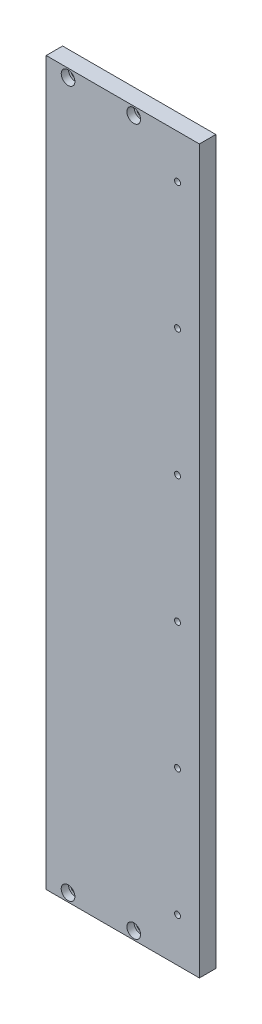
ISO-10303-21;
HEADER;
FILE_DESCRIPTION(('STEP AP214'),'2;1');
FILE_NAME('part.step','',(''),(''),'','','');
FILE_SCHEMA(('AUTOMOTIVE_DESIGN { 1 0 10303 214 1 1 1 1 }'));
ENDSEC;
DATA;
#1=APPLICATION_CONTEXT('core data for automotive mechanical design processes');
#2=APPLICATION_PROTOCOL_DEFINITION('international standard','automotive_design',2000,#1);
#3=PRODUCT_CONTEXT('',#1,'mechanical');
#4=PRODUCT('Part','Part','',(#3));
#5=PRODUCT_RELATED_PRODUCT_CATEGORY('part','',(#4));
#6=PRODUCT_DEFINITION_FORMATION('','',#4);
#7=PRODUCT_DEFINITION_CONTEXT('part definition',#1,'design');
#8=PRODUCT_DEFINITION('design','',#6,#7);
#9=PRODUCT_DEFINITION_SHAPE('','',#8);
#10=(LENGTH_UNIT() NAMED_UNIT(*) SI_UNIT(.MILLI.,.METRE.));
#11=(NAMED_UNIT(*) PLANE_ANGLE_UNIT() SI_UNIT($,.RADIAN.));
#12=(NAMED_UNIT(*) SI_UNIT($,.STERADIAN.) SOLID_ANGLE_UNIT());
#13=UNCERTAINTY_MEASURE_WITH_UNIT(LENGTH_MEASURE(1.E-05),#10,'distance_accuracy_value','');
#14=(GEOMETRIC_REPRESENTATION_CONTEXT(3) GLOBAL_UNCERTAINTY_ASSIGNED_CONTEXT((#13)) GLOBAL_UNIT_ASSIGNED_CONTEXT((#10,
#11,#12)) REPRESENTATION_CONTEXT('',''));
#15=CARTESIAN_POINT('',(0.,0.,0.));
#16=DIRECTION('',(0.,0.,1.));
#17=DIRECTION('',(1.,0.,0.));
#18=AXIS2_PLACEMENT_3D('',#15,#16,#17);
#19=CARTESIAN_POINT('',(-31.5092335801981,419.1,5.87188926459969));
#20=DIRECTION('',(1.,0.,0.));
#21=DIRECTION('',(0.,0.,-1.));
#22=AXIS2_PLACEMENT_3D('',#19,#20,#21);
#23=PLANE('',#22);
#24=CARTESIAN_POINT('',(-31.5092335801981,25.4,1.10938926459969));
#25=DIRECTION('',(-1.,0.,0.));
#26=DIRECTION('',(0.,0.,1.));
#27=AXIS2_PLACEMENT_3D('',#24,#25,#26);
#28=CIRCLE('',#27,1.7272);
#29=CARTESIAN_POINT('',(-31.5092335801981,25.4,2.83658926459969));
#30=VERTEX_POINT('',#29);
#31=EDGE_CURVE('E132',#30,#30,#28,.T.);
#32=ORIENTED_EDGE('',*,*,#31,.F.);
#33=EDGE_LOOP('',(#32));
#34=FACE_BOUND('',#33,.T.);
#35=CARTESIAN_POINT('',(-31.5092335801981,99.06,1.10938926459969));
#36=DIRECTION('',(-1.,0.,0.));
#37=DIRECTION('',(0.,0.,1.));
#38=AXIS2_PLACEMENT_3D('',#35,#36,#37);
#39=CIRCLE('',#38,1.7272);
#40=CARTESIAN_POINT('',(-31.5092335801981,99.06,2.83658926459969));
#41=VERTEX_POINT('',#40);
#42=EDGE_CURVE('E131',#41,#41,#39,.T.);
#43=ORIENTED_EDGE('',*,*,#42,.F.);
#44=EDGE_LOOP('',(#43));
#45=FACE_BOUND('',#44,.T.);
#46=CARTESIAN_POINT('',(-31.5092335801981,172.72,1.10938926459969));
#47=DIRECTION('',(-1.,0.,0.));
#48=DIRECTION('',(0.,0.,1.));
#49=AXIS2_PLACEMENT_3D('',#46,#47,#48);
#50=CIRCLE('',#49,1.72719999999998);
#51=CARTESIAN_POINT('',(-31.5092335801981,172.72,2.83658926459968));
#52=VERTEX_POINT('',#51);
#53=EDGE_CURVE('E142',#52,#52,#50,.T.);
#54=ORIENTED_EDGE('',*,*,#53,.F.);
#55=EDGE_LOOP('',(#54));
#56=FACE_BOUND('',#55,.T.);
#57=CARTESIAN_POINT('',(-31.5092335801981,246.38,1.10938926459969));
#58=DIRECTION('',(-1.,0.,0.));
#59=DIRECTION('',(0.,0.,1.));
#60=AXIS2_PLACEMENT_3D('',#57,#58,#59);
#61=CIRCLE('',#60,1.72719999999998);
#62=CARTESIAN_POINT('',(-31.5092335801981,246.38,2.83658926459968));
#63=VERTEX_POINT('',#62);
#64=EDGE_CURVE('E148',#63,#63,#61,.T.);
#65=ORIENTED_EDGE('',*,*,#64,.F.);
#66=EDGE_LOOP('',(#65));
#67=FACE_BOUND('',#66,.T.);
#68=CARTESIAN_POINT('',(-31.5092335801981,320.04,1.10938926459969));
#69=DIRECTION('',(-1.,0.,0.));
#70=DIRECTION('',(0.,0.,1.));
#71=AXIS2_PLACEMENT_3D('',#68,#69,#70);
#72=CIRCLE('',#71,1.72719999999998);
#73=CARTESIAN_POINT('',(-31.5092335801981,320.04,2.83658926459968));
#74=VERTEX_POINT('',#73);
#75=EDGE_CURVE('E154',#74,#74,#72,.T.);
#76=ORIENTED_EDGE('',*,*,#75,.F.);
#77=EDGE_LOOP('',(#76));
#78=FACE_BOUND('',#77,.T.);
#79=CARTESIAN_POINT('',(-31.5092335801981,393.7,1.10938926459969));
#80=DIRECTION('',(-1.,0.,0.));
#81=DIRECTION('',(0.,0.,1.));
#82=AXIS2_PLACEMENT_3D('',#79,#80,#81);
#83=CIRCLE('',#82,1.72719999999998);
#84=CARTESIAN_POINT('',(-31.5092335801981,393.7,2.83658926459968));
#85=VERTEX_POINT('',#84);
#86=EDGE_CURVE('E160',#85,#85,#83,.T.);
#87=ORIENTED_EDGE('',*,*,#86,.F.);
#88=EDGE_LOOP('',(#87));
#89=FACE_BOUND('',#88,.T.);
#90=DIRECTION('',(0.,0.,1.));
#91=VECTOR('',#90,1.);
#92=CARTESIAN_POINT('',(-31.5092335801981,0.,5.87188926459969));
#93=LINE('',#92,#91);
#94=CARTESIAN_POINT('',(-31.5092335801981,0.,-3.65311073540031));
#95=VERTEX_POINT('',#94);
#96=CARTESIAN_POINT('',(-31.5092335801981,0.,5.87188926459969));
#97=VERTEX_POINT('',#96);
#98=EDGE_CURVE('E250',#95,#97,#93,.T.);
#99=ORIENTED_EDGE('',*,*,#98,.T.);
#100=DIRECTION('',(0.,-1.,0.));
#101=VECTOR('',#100,1.);
#102=CARTESIAN_POINT('',(-31.5092335801981,419.1,5.87188926459969));
#103=LINE('',#102,#101);
#104=CARTESIAN_POINT('',(-31.5092335801981,419.1,5.87188926459969));
#105=VERTEX_POINT('',#104);
#106=EDGE_CURVE('E11',#105,#97,#103,.T.);
#107=ORIENTED_EDGE('',*,*,#106,.F.);
#108=DIRECTION('',(0.,0.,1.));
#109=VECTOR('',#108,1.);
#110=CARTESIAN_POINT('',(-31.5092335801981,419.1,5.87188926459969));
#111=LINE('',#110,#109);
#112=CARTESIAN_POINT('',(-31.5092335801981,419.1,-3.65311073540031));
#113=VERTEX_POINT('',#112);
#114=EDGE_CURVE('E251',#113,#105,#111,.T.);
#115=ORIENTED_EDGE('',*,*,#114,.F.);
#116=DIRECTION('',(0.,-1.,0.));
#117=VECTOR('',#116,1.);
#118=CARTESIAN_POINT('',(-31.5092335801981,419.1,-3.65311073540031));
#119=LINE('',#118,#117);
#120=EDGE_CURVE('E257',#113,#95,#119,.T.);
#121=ORIENTED_EDGE('',*,*,#120,.T.);
#122=EDGE_LOOP('',(#99,#107,#115,#121));
#123=FACE_BOUND('',#122,.T.);
#124=ADVANCED_FACE('F37',(#34,#45,#56,#67,#78,#89,#123),#23,.F.);
#125=CARTESIAN_POINT('',(-31.5092335801981,419.1,5.87188926459969));
#126=DIRECTION('',(0.,0.,-1.));
#127=DIRECTION('',(-1.,0.,0.));
#128=AXIS2_PLACEMENT_3D('',#125,#126,#127);
#129=PLANE('',#128);
#130=CARTESIAN_POINT('',(19.2907664198019,414.3375,5.87188926459969));
#131=DIRECTION('',(0.,0.,1.));
#132=DIRECTION('',(1.,0.,0.));
#133=AXIS2_PLACEMENT_3D('',#130,#131,#132);
#134=CIRCLE('',#133,3.96875);
#135=CARTESIAN_POINT('',(23.2595164198019,414.3375,5.87188926459969));
#136=VERTEX_POINT('',#135);
#137=EDGE_CURVE('E166',#136,#136,#134,.T.);
#138=ORIENTED_EDGE('',*,*,#137,.F.);
#139=EDGE_LOOP('',(#138));
#140=FACE_BOUND('',#139,.T.);
#141=CARTESIAN_POINT('',(-18.8092335801981,414.3375,5.87188926459969));
#142=DIRECTION('',(0.,0.,1.));
#143=DIRECTION('',(1.,0.,0.));
#144=AXIS2_PLACEMENT_3D('',#141,#142,#143);
#145=CIRCLE('',#144,3.96875);
#146=CARTESIAN_POINT('',(-14.8404835801981,414.3375,5.87188926459969));
#147=VERTEX_POINT('',#146);
#148=EDGE_CURVE('E178',#147,#147,#145,.T.);
#149=ORIENTED_EDGE('',*,*,#148,.F.);
#150=EDGE_LOOP('',(#149));
#151=FACE_BOUND('',#150,.T.);
#152=CARTESIAN_POINT('',(-18.8092335801981,4.7625,5.87188926459969));
#153=DIRECTION('',(0.,0.,1.));
#154=DIRECTION('',(1.,0.,0.));
#155=AXIS2_PLACEMENT_3D('',#152,#153,#154);
#156=CIRCLE('',#155,3.96875);
#157=CARTESIAN_POINT('',(-14.8404835801981,4.7625,5.87188926459969));
#158=VERTEX_POINT('',#157);
#159=EDGE_CURVE('E190',#158,#158,#156,.T.);
#160=ORIENTED_EDGE('',*,*,#159,.F.);
#161=EDGE_LOOP('',(#160));
#162=FACE_BOUND('',#161,.T.);
#163=CARTESIAN_POINT('',(19.2907664198019,4.7625,5.87188926459969));
#164=DIRECTION('',(0.,0.,1.));
#165=DIRECTION('',(1.,0.,0.));
#166=AXIS2_PLACEMENT_3D('',#163,#164,#165);
#167=CIRCLE('',#166,3.96875);
#168=CARTESIAN_POINT('',(23.2595164198019,4.7625,5.87188926459969));
#169=VERTEX_POINT('',#168);
#170=EDGE_CURVE('E202',#169,#169,#167,.T.);
#171=ORIENTED_EDGE('',*,*,#170,.F.);
#172=EDGE_LOOP('',(#171));
#173=FACE_BOUND('',#172,.T.);
#174=CARTESIAN_POINT('',(44.6907664198019,25.4,5.87188926459969));
#175=DIRECTION('',(0.,0.,1.));
#176=DIRECTION('',(1.,0.,0.));
#177=AXIS2_PLACEMENT_3D('',#174,#175,#176);
#178=CIRCLE('',#177,1.7272);
#179=CARTESIAN_POINT('',(46.4179664198019,25.4,5.87188926459969));
#180=VERTEX_POINT('',#179);
#181=EDGE_CURVE('E214',#180,#180,#178,.T.);
#182=ORIENTED_EDGE('',*,*,#181,.F.);
#183=EDGE_LOOP('',(#182));
#184=FACE_BOUND('',#183,.T.);
#185=CARTESIAN_POINT('',(44.6907664198019,99.06,5.87188926459969));
#186=DIRECTION('',(0.,0.,1.));
#187=DIRECTION('',(1.,0.,0.));
#188=AXIS2_PLACEMENT_3D('',#185,#186,#187);
#189=CIRCLE('',#188,1.7272);
#190=CARTESIAN_POINT('',(46.4179664198019,99.06,5.87188926459969));
#191=VERTEX_POINT('',#190);
#192=EDGE_CURVE('E220',#191,#191,#189,.T.);
#193=ORIENTED_EDGE('',*,*,#192,.F.);
#194=EDGE_LOOP('',(#193));
#195=FACE_BOUND('',#194,.T.);
#196=CARTESIAN_POINT('',(44.6907664198019,172.72,5.87188926459969));
#197=DIRECTION('',(0.,0.,1.));
#198=DIRECTION('',(1.,0.,0.));
#199=AXIS2_PLACEMENT_3D('',#196,#197,#198);
#200=CIRCLE('',#199,1.7272);
#201=CARTESIAN_POINT('',(46.4179664198019,172.72,5.87188926459969));
#202=VERTEX_POINT('',#201);
#203=EDGE_CURVE('E226',#202,#202,#200,.T.);
#204=ORIENTED_EDGE('',*,*,#203,.F.);
#205=EDGE_LOOP('',(#204));
#206=FACE_BOUND('',#205,.T.);
#207=CARTESIAN_POINT('',(44.6907664198019,246.38,5.87188926459969));
#208=DIRECTION('',(0.,0.,1.));
#209=DIRECTION('',(1.,0.,0.));
#210=AXIS2_PLACEMENT_3D('',#207,#208,#209);
#211=CIRCLE('',#210,1.7272);
#212=CARTESIAN_POINT('',(46.4179664198019,246.38,5.87188926459969));
#213=VERTEX_POINT('',#212);
#214=EDGE_CURVE('E232',#213,#213,#211,.T.);
#215=ORIENTED_EDGE('',*,*,#214,.F.);
#216=EDGE_LOOP('',(#215));
#217=FACE_BOUND('',#216,.T.);
#218=CARTESIAN_POINT('',(44.6907664198019,320.04,5.87188926459969));
#219=DIRECTION('',(0.,0.,1.));
#220=DIRECTION('',(1.,0.,0.));
#221=AXIS2_PLACEMENT_3D('',#218,#219,#220);
#222=CIRCLE('',#221,1.7272);
#223=CARTESIAN_POINT('',(46.4179664198019,320.04,5.87188926459969));
#224=VERTEX_POINT('',#223);
#225=EDGE_CURVE('E238',#224,#224,#222,.T.);
#226=ORIENTED_EDGE('',*,*,#225,.F.);
#227=EDGE_LOOP('',(#226));
#228=FACE_BOUND('',#227,.T.);
#229=CARTESIAN_POINT('',(44.6907664198019,393.7,5.87188926459969));
#230=DIRECTION('',(0.,0.,1.));
#231=DIRECTION('',(1.,0.,0.));
#232=AXIS2_PLACEMENT_3D('',#229,#230,#231);
#233=CIRCLE('',#232,1.7272);
#234=CARTESIAN_POINT('',(46.4179664198019,393.7,5.87188926459969));
#235=VERTEX_POINT('',#234);
#236=EDGE_CURVE('E244',#235,#235,#233,.T.);
#237=ORIENTED_EDGE('',*,*,#236,.F.);
#238=EDGE_LOOP('',(#237));
#239=FACE_BOUND('',#238,.T.);
#240=DIRECTION('',(1.,0.,0.));
#241=VECTOR('',#240,1.);
#242=CARTESIAN_POINT('',(-31.5092335801981,0.,5.87188926459969));
#243=LINE('',#242,#241);
#244=CARTESIAN_POINT('',(57.3907664198019,0.,5.87188926459969));
#245=VERTEX_POINT('',#244);
#246=EDGE_CURVE('E260',#97,#245,#243,.T.);
#247=ORIENTED_EDGE('',*,*,#246,.T.);
#248=DIRECTION('',(0.,-1.,0.));
#249=VECTOR('',#248,1.);
#250=CARTESIAN_POINT('',(57.3907664198019,419.1,5.87188926459969));
#251=LINE('',#250,#249);
#252=CARTESIAN_POINT('',(57.3907664198019,419.1,5.87188926459969));
#253=VERTEX_POINT('',#252);
#254=EDGE_CURVE('E45',#253,#245,#251,.T.);
#255=ORIENTED_EDGE('',*,*,#254,.F.);
#256=DIRECTION('',(1.,0.,0.));
#257=VECTOR('',#256,1.);
#258=CARTESIAN_POINT('',(-31.5092335801981,419.1,5.87188926459969));
#259=LINE('',#258,#257);
#260=EDGE_CURVE('E84',#105,#253,#259,.T.);
#261=ORIENTED_EDGE('',*,*,#260,.F.);
#262=ORIENTED_EDGE('',*,*,#106,.T.);
#263=EDGE_LOOP('',(#247,#255,#261,#262));
#264=FACE_BOUND('',#263,.T.);
#265=ADVANCED_FACE('F284',(#140,#151,#162,#173,#184,#195,#206,#217,#228,#239,#264),#129,.F.);
#266=CARTESIAN_POINT('',(57.3907664198019,419.1,5.87188926459969));
#267=DIRECTION('',(-1.,0.,0.));
#268=DIRECTION('',(0.,0.,1.));
#269=AXIS2_PLACEMENT_3D('',#266,#267,#268);
#270=PLANE('',#269);
#271=DIRECTION('',(0.,0.,-1.));
#272=VECTOR('',#271,1.);
#273=CARTESIAN_POINT('',(57.3907664198019,0.,5.87188926459969));
#274=LINE('',#273,#272);
#275=CARTESIAN_POINT('',(57.3907664198019,0.,-3.65311073540031));
#276=VERTEX_POINT('',#275);
#277=EDGE_CURVE('E71',#245,#276,#274,.T.);
#278=ORIENTED_EDGE('',*,*,#277,.T.);
#279=DIRECTION('',(0.,-1.,0.));
#280=VECTOR('',#279,1.);
#281=CARTESIAN_POINT('',(57.3907664198019,419.1,-3.65311073540031));
#282=LINE('',#281,#280);
#283=CARTESIAN_POINT('',(57.3907664198019,419.1,-3.65311073540031));
#284=VERTEX_POINT('',#283);
#285=EDGE_CURVE('E265',#284,#276,#282,.T.);
#286=ORIENTED_EDGE('',*,*,#285,.F.);
#287=DIRECTION('',(0.,0.,-1.));
#288=VECTOR('',#287,1.);
#289=CARTESIAN_POINT('',(57.3907664198019,419.1,5.87188926459969));
#290=LINE('',#289,#288);
#291=EDGE_CURVE('E254',#253,#284,#290,.T.);
#292=ORIENTED_EDGE('',*,*,#291,.F.);
#293=ORIENTED_EDGE('',*,*,#254,.T.);
#294=EDGE_LOOP('',(#278,#286,#292,#293));
#295=FACE_BOUND('',#294,.T.);
#296=ADVANCED_FACE('F267',(#295),#270,.F.);
#297=CARTESIAN_POINT('',(-31.5092335801981,419.1,-3.65311073540031));
#298=DIRECTION('',(0.,0.,1.));
#299=DIRECTION('',(1.,0.,0.));
#300=AXIS2_PLACEMENT_3D('',#297,#298,#299);
#301=PLANE('',#300);
#302=CARTESIAN_POINT('',(19.2907664198019,414.3375,-3.65311073540031));
#303=DIRECTION('',(0.,0.,1.));
#304=DIRECTION('',(1.,0.,0.));
#305=AXIS2_PLACEMENT_3D('',#302,#303,#304);
#306=CIRCLE('',#305,2.45745);
#307=CARTESIAN_POINT('',(21.7482164198019,414.3375,-3.65311073540031));
#308=VERTEX_POINT('',#307);
#309=EDGE_CURVE('E175',#308,#308,#306,.T.);
#310=ORIENTED_EDGE('',*,*,#309,.T.);
#311=EDGE_LOOP('',(#310));
#312=FACE_BOUND('',#311,.T.);
#313=CARTESIAN_POINT('',(-18.8092335801981,414.3375,-3.65311073540031));
#314=DIRECTION('',(0.,0.,1.));
#315=DIRECTION('',(1.,0.,0.));
#316=AXIS2_PLACEMENT_3D('',#313,#314,#315);
#317=CIRCLE('',#316,2.45745);
#318=CARTESIAN_POINT('',(-16.3517835801981,414.3375,-3.65311073540031));
#319=VERTEX_POINT('',#318);
#320=EDGE_CURVE('E187',#319,#319,#317,.T.);
#321=ORIENTED_EDGE('',*,*,#320,.T.);
#322=EDGE_LOOP('',(#321));
#323=FACE_BOUND('',#322,.T.);
#324=CARTESIAN_POINT('',(-18.8092335801981,4.7625,-3.65311073540031));
#325=DIRECTION('',(0.,0.,1.));
#326=DIRECTION('',(1.,0.,0.));
#327=AXIS2_PLACEMENT_3D('',#324,#325,#326);
#328=CIRCLE('',#327,2.45745);
#329=CARTESIAN_POINT('',(-16.3517835801981,4.7625,-3.65311073540031));
#330=VERTEX_POINT('',#329);
#331=EDGE_CURVE('E199',#330,#330,#328,.T.);
#332=ORIENTED_EDGE('',*,*,#331,.T.);
#333=EDGE_LOOP('',(#332));
#334=FACE_BOUND('',#333,.T.);
#335=CARTESIAN_POINT('',(19.2907664198019,4.7625,-3.65311073540031));
#336=DIRECTION('',(0.,0.,1.));
#337=DIRECTION('',(1.,0.,0.));
#338=AXIS2_PLACEMENT_3D('',#335,#336,#337);
#339=CIRCLE('',#338,2.45745);
#340=CARTESIAN_POINT('',(21.7482164198019,4.7625,-3.65311073540031));
#341=VERTEX_POINT('',#340);
#342=EDGE_CURVE('E211',#341,#341,#339,.T.);
#343=ORIENTED_EDGE('',*,*,#342,.T.);
#344=EDGE_LOOP('',(#343));
#345=FACE_BOUND('',#344,.T.);
#346=DIRECTION('',(-1.,0.,0.));
#347=VECTOR('',#346,1.);
#348=CARTESIAN_POINT('',(-31.5092335801981,0.,-3.65311073540031));
#349=LINE('',#348,#347);
#350=EDGE_CURVE('E77',#276,#95,#349,.T.);
#351=ORIENTED_EDGE('',*,*,#350,.T.);
#352=ORIENTED_EDGE('',*,*,#120,.F.);
#353=DIRECTION('',(-1.,0.,0.));
#354=VECTOR('',#353,1.);
#355=CARTESIAN_POINT('',(-31.5092335801981,419.1,-3.65311073540031));
#356=LINE('',#355,#354);
#357=EDGE_CURVE('E53',#284,#113,#356,.T.);
#358=ORIENTED_EDGE('',*,*,#357,.F.);
#359=ORIENTED_EDGE('',*,*,#285,.T.);
#360=EDGE_LOOP('',(#351,#352,#358,#359));
#361=FACE_BOUND('',#360,.T.);
#362=ADVANCED_FACE('F274',(#312,#323,#334,#345,#361),#301,.F.);
#363=CARTESIAN_POINT('',(0.,419.1,0.));
#364=DIRECTION('',(0.,-1.,0.));
#365=DIRECTION('',(0.,0.,-1.));
#366=AXIS2_PLACEMENT_3D('',#363,#364,#365);
#367=PLANE('',#366);
#368=ORIENTED_EDGE('',*,*,#114,.T.);
#369=ORIENTED_EDGE('',*,*,#260,.T.);
#370=ORIENTED_EDGE('',*,*,#291,.T.);
#371=ORIENTED_EDGE('',*,*,#357,.T.);
#372=EDGE_LOOP('',(#368,#369,#370,#371));
#373=FACE_BOUND('',#372,.T.);
#374=ADVANCED_FACE('F276',(#373),#367,.F.);
#375=CARTESIAN_POINT('',(0.,0.,0.));
#376=DIRECTION('',(0.,-1.,0.));
#377=DIRECTION('',(0.,0.,-1.));
#378=AXIS2_PLACEMENT_3D('',#375,#376,#377);
#379=PLANE('',#378);
#380=ORIENTED_EDGE('',*,*,#98,.F.);
#381=ORIENTED_EDGE('',*,*,#350,.F.);
#382=ORIENTED_EDGE('',*,*,#277,.F.);
#383=ORIENTED_EDGE('',*,*,#246,.F.);
#384=EDGE_LOOP('',(#380,#381,#382,#383));
#385=FACE_BOUND('',#384,.T.);
#386=ADVANCED_FACE('F270',(#385),#379,.T.);
#387=CARTESIAN_POINT('',(44.6907664198019,393.7,-1.7481107354003));
#388=DIRECTION('',(0.,0.,1.));
#389=DIRECTION('',(1.,0.,0.));
#390=AXIS2_PLACEMENT_3D('',#387,#388,#389);
#391=CONICAL_SURFACE('',#390,1.7272,1.02974425867665);
#392=CARTESIAN_POINT('',(44.6907664198019,393.7,-2.78591719658471));
#393=VERTEX_POINT('',#392);
#394=VERTEX_LOOP('',#393);
#395=FACE_BOUND('',#394,.T.);
#396=CARTESIAN_POINT('',(44.6907664198019,393.7,-1.7481107354003));
#397=DIRECTION('',(0.,0.,1.));
#398=DIRECTION('',(1.,0.,0.));
#399=AXIS2_PLACEMENT_3D('',#396,#397,#398);
#400=CIRCLE('',#399,1.7272);
#401=CARTESIAN_POINT('',(46.4179664198019,393.7,-1.7481107354003));
#402=VERTEX_POINT('',#401);
#403=EDGE_CURVE('E247',#402,#402,#400,.T.);
#404=ORIENTED_EDGE('',*,*,#403,.T.);
#405=EDGE_LOOP('',(#404));
#406=FACE_BOUND('',#405,.T.);
#407=ADVANCED_FACE('F415',(#395,#406),#391,.F.);
#408=CARTESIAN_POINT('',(44.6907664198019,393.7,5.87188926459969));
#409=DIRECTION('',(0.,0.,1.));
#410=DIRECTION('',(1.,0.,0.));
#411=AXIS2_PLACEMENT_3D('',#408,#409,#410);
#412=CYLINDRICAL_SURFACE('',#411,1.7272);
#413=ORIENTED_EDGE('',*,*,#403,.F.);
#414=EDGE_LOOP('',(#413));
#415=FACE_BOUND('',#414,.T.);
#416=ORIENTED_EDGE('',*,*,#236,.T.);
#417=EDGE_LOOP('',(#416));
#418=FACE_BOUND('',#417,.T.);
#419=ADVANCED_FACE('F411',(#415,#418),#412,.F.);
#420=CARTESIAN_POINT('',(44.6907664198019,320.04,-1.7481107354003));
#421=DIRECTION('',(0.,0.,1.));
#422=DIRECTION('',(1.,0.,0.));
#423=AXIS2_PLACEMENT_3D('',#420,#421,#422);
#424=CONICAL_SURFACE('',#423,1.7272,1.02974425867665);
#425=CARTESIAN_POINT('',(44.6907664198019,320.04,-2.78591719658471));
#426=VERTEX_POINT('',#425);
#427=VERTEX_LOOP('',#426);
#428=FACE_BOUND('',#427,.T.);
#429=CARTESIAN_POINT('',(44.6907664198019,320.04,-1.7481107354003));
#430=DIRECTION('',(0.,0.,1.));
#431=DIRECTION('',(1.,0.,0.));
#432=AXIS2_PLACEMENT_3D('',#429,#430,#431);
#433=CIRCLE('',#432,1.7272);
#434=CARTESIAN_POINT('',(46.4179664198019,320.04,-1.7481107354003));
#435=VERTEX_POINT('',#434);
#436=EDGE_CURVE('E241',#435,#435,#433,.T.);
#437=ORIENTED_EDGE('',*,*,#436,.T.);
#438=EDGE_LOOP('',(#437));
#439=FACE_BOUND('',#438,.T.);
#440=ADVANCED_FACE('F407',(#428,#439),#424,.F.);
#441=CARTESIAN_POINT('',(44.6907664198019,320.04,5.87188926459969));
#442=DIRECTION('',(0.,0.,1.));
#443=DIRECTION('',(1.,0.,0.));
#444=AXIS2_PLACEMENT_3D('',#441,#442,#443);
#445=CYLINDRICAL_SURFACE('',#444,1.7272);
#446=ORIENTED_EDGE('',*,*,#436,.F.);
#447=EDGE_LOOP('',(#446));
#448=FACE_BOUND('',#447,.T.);
#449=ORIENTED_EDGE('',*,*,#225,.T.);
#450=EDGE_LOOP('',(#449));
#451=FACE_BOUND('',#450,.T.);
#452=ADVANCED_FACE('F403',(#448,#451),#445,.F.);
#453=CARTESIAN_POINT('',(44.6907664198019,246.38,-1.7481107354003));
#454=DIRECTION('',(0.,0.,1.));
#455=DIRECTION('',(1.,0.,0.));
#456=AXIS2_PLACEMENT_3D('',#453,#454,#455);
#457=CONICAL_SURFACE('',#456,1.7272,1.02974425867665);
#458=CARTESIAN_POINT('',(44.6907664198019,246.38,-2.78591719658471));
#459=VERTEX_POINT('',#458);
#460=VERTEX_LOOP('',#459);
#461=FACE_BOUND('',#460,.T.);
#462=CARTESIAN_POINT('',(44.6907664198019,246.38,-1.7481107354003));
#463=DIRECTION('',(0.,0.,1.));
#464=DIRECTION('',(1.,0.,0.));
#465=AXIS2_PLACEMENT_3D('',#462,#463,#464);
#466=CIRCLE('',#465,1.7272);
#467=CARTESIAN_POINT('',(46.4179664198019,246.38,-1.7481107354003));
#468=VERTEX_POINT('',#467);
#469=EDGE_CURVE('E235',#468,#468,#466,.T.);
#470=ORIENTED_EDGE('',*,*,#469,.T.);
#471=EDGE_LOOP('',(#470));
#472=FACE_BOUND('',#471,.T.);
#473=ADVANCED_FACE('F399',(#461,#472),#457,.F.);
#474=CARTESIAN_POINT('',(44.6907664198019,246.38,5.87188926459969));
#475=DIRECTION('',(0.,0.,1.));
#476=DIRECTION('',(1.,0.,0.));
#477=AXIS2_PLACEMENT_3D('',#474,#475,#476);
#478=CYLINDRICAL_SURFACE('',#477,1.7272);
#479=ORIENTED_EDGE('',*,*,#469,.F.);
#480=EDGE_LOOP('',(#479));
#481=FACE_BOUND('',#480,.T.);
#482=ORIENTED_EDGE('',*,*,#214,.T.);
#483=EDGE_LOOP('',(#482));
#484=FACE_BOUND('',#483,.T.);
#485=ADVANCED_FACE('F395',(#481,#484),#478,.F.);
#486=CARTESIAN_POINT('',(44.6907664198019,172.72,-1.7481107354003));
#487=DIRECTION('',(0.,0.,1.));
#488=DIRECTION('',(1.,0.,0.));
#489=AXIS2_PLACEMENT_3D('',#486,#487,#488);
#490=CONICAL_SURFACE('',#489,1.7272,1.02974425867665);
#491=CARTESIAN_POINT('',(44.6907664198019,172.72,-2.78591719658471));
#492=VERTEX_POINT('',#491);
#493=VERTEX_LOOP('',#492);
#494=FACE_BOUND('',#493,.T.);
#495=CARTESIAN_POINT('',(44.6907664198019,172.72,-1.7481107354003));
#496=DIRECTION('',(0.,0.,1.));
#497=DIRECTION('',(1.,0.,0.));
#498=AXIS2_PLACEMENT_3D('',#495,#496,#497);
#499=CIRCLE('',#498,1.7272);
#500=CARTESIAN_POINT('',(46.4179664198019,172.72,-1.7481107354003));
#501=VERTEX_POINT('',#500);
#502=EDGE_CURVE('E229',#501,#501,#499,.T.);
#503=ORIENTED_EDGE('',*,*,#502,.T.);
#504=EDGE_LOOP('',(#503));
#505=FACE_BOUND('',#504,.T.);
#506=ADVANCED_FACE('F391',(#494,#505),#490,.F.);
#507=CARTESIAN_POINT('',(44.6907664198019,172.72,5.87188926459969));
#508=DIRECTION('',(0.,0.,1.));
#509=DIRECTION('',(1.,0.,0.));
#510=AXIS2_PLACEMENT_3D('',#507,#508,#509);
#511=CYLINDRICAL_SURFACE('',#510,1.7272);
#512=ORIENTED_EDGE('',*,*,#502,.F.);
#513=EDGE_LOOP('',(#512));
#514=FACE_BOUND('',#513,.T.);
#515=ORIENTED_EDGE('',*,*,#203,.T.);
#516=EDGE_LOOP('',(#515));
#517=FACE_BOUND('',#516,.T.);
#518=ADVANCED_FACE('F387',(#514,#517),#511,.F.);
#519=CARTESIAN_POINT('',(44.6907664198019,99.06,-1.7481107354003));
#520=DIRECTION('',(0.,0.,1.));
#521=DIRECTION('',(1.,0.,0.));
#522=AXIS2_PLACEMENT_3D('',#519,#520,#521);
#523=CONICAL_SURFACE('',#522,1.7272,1.02974425867665);
#524=CARTESIAN_POINT('',(44.6907664198019,99.06,-2.78591719658471));
#525=VERTEX_POINT('',#524);
#526=VERTEX_LOOP('',#525);
#527=FACE_BOUND('',#526,.T.);
#528=CARTESIAN_POINT('',(44.6907664198019,99.06,-1.7481107354003));
#529=DIRECTION('',(0.,0.,1.));
#530=DIRECTION('',(1.,0.,0.));
#531=AXIS2_PLACEMENT_3D('',#528,#529,#530);
#532=CIRCLE('',#531,1.7272);
#533=CARTESIAN_POINT('',(46.4179664198019,99.06,-1.7481107354003));
#534=VERTEX_POINT('',#533);
#535=EDGE_CURVE('E223',#534,#534,#532,.T.);
#536=ORIENTED_EDGE('',*,*,#535,.T.);
#537=EDGE_LOOP('',(#536));
#538=FACE_BOUND('',#537,.T.);
#539=ADVANCED_FACE('F383',(#527,#538),#523,.F.);
#540=CARTESIAN_POINT('',(44.6907664198019,99.06,5.87188926459969));
#541=DIRECTION('',(0.,0.,1.));
#542=DIRECTION('',(1.,0.,0.));
#543=AXIS2_PLACEMENT_3D('',#540,#541,#542);
#544=CYLINDRICAL_SURFACE('',#543,1.7272);
#545=ORIENTED_EDGE('',*,*,#535,.F.);
#546=EDGE_LOOP('',(#545));
#547=FACE_BOUND('',#546,.T.);
#548=ORIENTED_EDGE('',*,*,#192,.T.);
#549=EDGE_LOOP('',(#548));
#550=FACE_BOUND('',#549,.T.);
#551=ADVANCED_FACE('F379',(#547,#550),#544,.F.);
#552=CARTESIAN_POINT('',(44.6907664198019,25.4,-1.7481107354003));
#553=DIRECTION('',(0.,0.,1.));
#554=DIRECTION('',(1.,0.,0.));
#555=AXIS2_PLACEMENT_3D('',#552,#553,#554);
#556=CONICAL_SURFACE('',#555,1.7272,1.02974425867665);
#557=CARTESIAN_POINT('',(44.6907664198019,25.4,-2.78591719658471));
#558=VERTEX_POINT('',#557);
#559=VERTEX_LOOP('',#558);
#560=FACE_BOUND('',#559,.T.);
#561=CARTESIAN_POINT('',(44.6907664198019,25.4,-1.7481107354003));
#562=DIRECTION('',(0.,0.,1.));
#563=DIRECTION('',(1.,0.,0.));
#564=AXIS2_PLACEMENT_3D('',#561,#562,#563);
#565=CIRCLE('',#564,1.7272);
#566=CARTESIAN_POINT('',(46.4179664198019,25.4,-1.7481107354003));
#567=VERTEX_POINT('',#566);
#568=EDGE_CURVE('E217',#567,#567,#565,.T.);
#569=ORIENTED_EDGE('',*,*,#568,.T.);
#570=EDGE_LOOP('',(#569));
#571=FACE_BOUND('',#570,.T.);
#572=ADVANCED_FACE('F375',(#560,#571),#556,.F.);
#573=CARTESIAN_POINT('',(44.6907664198019,25.4,5.87188926459969));
#574=DIRECTION('',(0.,0.,1.));
#575=DIRECTION('',(1.,0.,0.));
#576=AXIS2_PLACEMENT_3D('',#573,#574,#575);
#577=CYLINDRICAL_SURFACE('',#576,1.7272);
#578=ORIENTED_EDGE('',*,*,#568,.F.);
#579=EDGE_LOOP('',(#578));
#580=FACE_BOUND('',#579,.T.);
#581=ORIENTED_EDGE('',*,*,#181,.T.);
#582=EDGE_LOOP('',(#581));
#583=FACE_BOUND('',#582,.T.);
#584=ADVANCED_FACE('F371',(#580,#583),#577,.F.);
#585=CARTESIAN_POINT('',(19.2907664198019,4.7625,5.87188926459969));
#586=DIRECTION('',(0.,0.,1.));
#587=DIRECTION('',(1.,0.,0.));
#588=AXIS2_PLACEMENT_3D('',#585,#586,#587);
#589=CYLINDRICAL_SURFACE('',#588,2.45745);
#590=ORIENTED_EDGE('',*,*,#342,.F.);
#591=EDGE_LOOP('',(#590));
#592=FACE_BOUND('',#591,.T.);
#593=CARTESIAN_POINT('',(19.2907664198019,4.7625,1.70628926459969));
#594=DIRECTION('',(0.,0.,1.));
#595=DIRECTION('',(1.,0.,0.));
#596=AXIS2_PLACEMENT_3D('',#593,#594,#595);
#597=CIRCLE('',#596,2.45745);
#598=CARTESIAN_POINT('',(21.7482164198019,4.7625,1.70628926459969));
#599=VERTEX_POINT('',#598);
#600=EDGE_CURVE('E208',#599,#599,#597,.T.);
#601=ORIENTED_EDGE('',*,*,#600,.T.);
#602=EDGE_LOOP('',(#601));
#603=FACE_BOUND('',#602,.T.);
#604=ADVANCED_FACE('F367',(#592,#603),#589,.F.);
#605=CARTESIAN_POINT('',(21.7482164198019,4.7625,1.70628926459969));
#606=DIRECTION('',(0.,0.,-1.));
#607=DIRECTION('',(-1.,0.,0.));
#608=AXIS2_PLACEMENT_3D('',#605,#606,#607);
#609=PLANE('',#608);
#610=ORIENTED_EDGE('',*,*,#600,.F.);
#611=EDGE_LOOP('',(#610));
#612=FACE_BOUND('',#611,.T.);
#613=CARTESIAN_POINT('',(19.2907664198019,4.7625,1.70628926459969));
#614=DIRECTION('',(0.,0.,1.));
#615=DIRECTION('',(1.,0.,0.));
#616=AXIS2_PLACEMENT_3D('',#613,#614,#615);
#617=CIRCLE('',#616,3.96875);
#618=CARTESIAN_POINT('',(23.2595164198019,4.7625,1.70628926459969));
#619=VERTEX_POINT('',#618);
#620=EDGE_CURVE('E205',#619,#619,#617,.T.);
#621=ORIENTED_EDGE('',*,*,#620,.T.);
#622=EDGE_LOOP('',(#621));
#623=FACE_BOUND('',#622,.T.);
#624=ADVANCED_FACE('F363',(#612,#623),#609,.F.);
#625=CARTESIAN_POINT('',(19.2907664198019,4.7625,5.87188926459969));
#626=DIRECTION('',(0.,0.,1.));
#627=DIRECTION('',(1.,0.,0.));
#628=AXIS2_PLACEMENT_3D('',#625,#626,#627);
#629=CYLINDRICAL_SURFACE('',#628,3.96875);
#630=ORIENTED_EDGE('',*,*,#620,.F.);
#631=EDGE_LOOP('',(#630));
#632=FACE_BOUND('',#631,.T.);
#633=ORIENTED_EDGE('',*,*,#170,.T.);
#634=EDGE_LOOP('',(#633));
#635=FACE_BOUND('',#634,.T.);
#636=ADVANCED_FACE('F359',(#632,#635),#629,.F.);
#637=CARTESIAN_POINT('',(-18.8092335801981,4.7625,5.87188926459969));
#638=DIRECTION('',(0.,0.,1.));
#639=DIRECTION('',(1.,0.,0.));
#640=AXIS2_PLACEMENT_3D('',#637,#638,#639);
#641=CYLINDRICAL_SURFACE('',#640,2.45745);
#642=ORIENTED_EDGE('',*,*,#331,.F.);
#643=EDGE_LOOP('',(#642));
#644=FACE_BOUND('',#643,.T.);
#645=CARTESIAN_POINT('',(-18.8092335801981,4.7625,1.70628926459969));
#646=DIRECTION('',(0.,0.,1.));
#647=DIRECTION('',(1.,0.,0.));
#648=AXIS2_PLACEMENT_3D('',#645,#646,#647);
#649=CIRCLE('',#648,2.45745);
#650=CARTESIAN_POINT('',(-16.3517835801981,4.7625,1.70628926459969));
#651=VERTEX_POINT('',#650);
#652=EDGE_CURVE('E196',#651,#651,#649,.T.);
#653=ORIENTED_EDGE('',*,*,#652,.T.);
#654=EDGE_LOOP('',(#653));
#655=FACE_BOUND('',#654,.T.);
#656=ADVANCED_FACE('F355',(#644,#655),#641,.F.);
#657=CARTESIAN_POINT('',(-16.3517835801981,4.7625,1.70628926459969));
#658=DIRECTION('',(0.,0.,-1.));
#659=DIRECTION('',(-1.,0.,0.));
#660=AXIS2_PLACEMENT_3D('',#657,#658,#659);
#661=PLANE('',#660);
#662=ORIENTED_EDGE('',*,*,#652,.F.);
#663=EDGE_LOOP('',(#662));
#664=FACE_BOUND('',#663,.T.);
#665=CARTESIAN_POINT('',(-18.8092335801981,4.7625,1.70628926459969));
#666=DIRECTION('',(0.,0.,1.));
#667=DIRECTION('',(1.,0.,0.));
#668=AXIS2_PLACEMENT_3D('',#665,#666,#667);
#669=CIRCLE('',#668,3.96875);
#670=CARTESIAN_POINT('',(-14.8404835801981,4.7625,1.70628926459969));
#671=VERTEX_POINT('',#670);
#672=EDGE_CURVE('E193',#671,#671,#669,.T.);
#673=ORIENTED_EDGE('',*,*,#672,.T.);
#674=EDGE_LOOP('',(#673));
#675=FACE_BOUND('',#674,.T.);
#676=ADVANCED_FACE('F351',(#664,#675),#661,.F.);
#677=CARTESIAN_POINT('',(-18.8092335801981,4.7625,5.87188926459969));
#678=DIRECTION('',(0.,0.,1.));
#679=DIRECTION('',(1.,0.,0.));
#680=AXIS2_PLACEMENT_3D('',#677,#678,#679);
#681=CYLINDRICAL_SURFACE('',#680,3.96875);
#682=ORIENTED_EDGE('',*,*,#672,.F.);
#683=EDGE_LOOP('',(#682));
#684=FACE_BOUND('',#683,.T.);
#685=ORIENTED_EDGE('',*,*,#159,.T.);
#686=EDGE_LOOP('',(#685));
#687=FACE_BOUND('',#686,.T.);
#688=ADVANCED_FACE('F347',(#684,#687),#681,.F.);
#689=CARTESIAN_POINT('',(-18.8092335801981,414.3375,5.87188926459969));
#690=DIRECTION('',(0.,0.,1.));
#691=DIRECTION('',(1.,0.,0.));
#692=AXIS2_PLACEMENT_3D('',#689,#690,#691);
#693=CYLINDRICAL_SURFACE('',#692,2.45745);
#694=ORIENTED_EDGE('',*,*,#320,.F.);
#695=EDGE_LOOP('',(#694));
#696=FACE_BOUND('',#695,.T.);
#697=CARTESIAN_POINT('',(-18.8092335801981,414.3375,1.70628926459969));
#698=DIRECTION('',(0.,0.,1.));
#699=DIRECTION('',(1.,0.,0.));
#700=AXIS2_PLACEMENT_3D('',#697,#698,#699);
#701=CIRCLE('',#700,2.45745);
#702=CARTESIAN_POINT('',(-16.3517835801981,414.3375,1.70628926459969));
#703=VERTEX_POINT('',#702);
#704=EDGE_CURVE('E184',#703,#703,#701,.T.);
#705=ORIENTED_EDGE('',*,*,#704,.T.);
#706=EDGE_LOOP('',(#705));
#707=FACE_BOUND('',#706,.T.);
#708=ADVANCED_FACE('F343',(#696,#707),#693,.F.);
#709=CARTESIAN_POINT('',(-16.3517835801981,414.3375,1.70628926459969));
#710=DIRECTION('',(0.,0.,-1.));
#711=DIRECTION('',(-1.,0.,0.));
#712=AXIS2_PLACEMENT_3D('',#709,#710,#711);
#713=PLANE('',#712);
#714=ORIENTED_EDGE('',*,*,#704,.F.);
#715=EDGE_LOOP('',(#714));
#716=FACE_BOUND('',#715,.T.);
#717=CARTESIAN_POINT('',(-18.8092335801981,414.3375,1.70628926459969));
#718=DIRECTION('',(0.,0.,1.));
#719=DIRECTION('',(1.,0.,0.));
#720=AXIS2_PLACEMENT_3D('',#717,#718,#719);
#721=CIRCLE('',#720,3.96875);
#722=CARTESIAN_POINT('',(-14.8404835801981,414.3375,1.70628926459969));
#723=VERTEX_POINT('',#722);
#724=EDGE_CURVE('E181',#723,#723,#721,.T.);
#725=ORIENTED_EDGE('',*,*,#724,.T.);
#726=EDGE_LOOP('',(#725));
#727=FACE_BOUND('',#726,.T.);
#728=ADVANCED_FACE('F339',(#716,#727),#713,.F.);
#729=CARTESIAN_POINT('',(-18.8092335801981,414.3375,5.87188926459969));
#730=DIRECTION('',(0.,0.,1.));
#731=DIRECTION('',(1.,0.,0.));
#732=AXIS2_PLACEMENT_3D('',#729,#730,#731);
#733=CYLINDRICAL_SURFACE('',#732,3.96875);
#734=ORIENTED_EDGE('',*,*,#724,.F.);
#735=EDGE_LOOP('',(#734));
#736=FACE_BOUND('',#735,.T.);
#737=ORIENTED_EDGE('',*,*,#148,.T.);
#738=EDGE_LOOP('',(#737));
#739=FACE_BOUND('',#738,.T.);
#740=ADVANCED_FACE('F335',(#736,#739),#733,.F.);
#741=CARTESIAN_POINT('',(19.2907664198019,414.3375,5.87188926459969));
#742=DIRECTION('',(0.,0.,1.));
#743=DIRECTION('',(1.,0.,0.));
#744=AXIS2_PLACEMENT_3D('',#741,#742,#743);
#745=CYLINDRICAL_SURFACE('',#744,2.45745);
#746=ORIENTED_EDGE('',*,*,#309,.F.);
#747=EDGE_LOOP('',(#746));
#748=FACE_BOUND('',#747,.T.);
#749=CARTESIAN_POINT('',(19.2907664198019,414.3375,1.70628926459969));
#750=DIRECTION('',(0.,0.,1.));
#751=DIRECTION('',(1.,0.,0.));
#752=AXIS2_PLACEMENT_3D('',#749,#750,#751);
#753=CIRCLE('',#752,2.45745);
#754=CARTESIAN_POINT('',(21.7482164198019,414.3375,1.70628926459969));
#755=VERTEX_POINT('',#754);
#756=EDGE_CURVE('E172',#755,#755,#753,.T.);
#757=ORIENTED_EDGE('',*,*,#756,.T.);
#758=EDGE_LOOP('',(#757));
#759=FACE_BOUND('',#758,.T.);
#760=ADVANCED_FACE('F331',(#748,#759),#745,.F.);
#761=CARTESIAN_POINT('',(21.7482164198019,414.3375,1.70628926459969));
#762=DIRECTION('',(0.,0.,-1.));
#763=DIRECTION('',(-1.,0.,0.));
#764=AXIS2_PLACEMENT_3D('',#761,#762,#763);
#765=PLANE('',#764);
#766=ORIENTED_EDGE('',*,*,#756,.F.);
#767=EDGE_LOOP('',(#766));
#768=FACE_BOUND('',#767,.T.);
#769=CARTESIAN_POINT('',(19.2907664198019,414.3375,1.70628926459969));
#770=DIRECTION('',(0.,0.,1.));
#771=DIRECTION('',(1.,0.,0.));
#772=AXIS2_PLACEMENT_3D('',#769,#770,#771);
#773=CIRCLE('',#772,3.96875);
#774=CARTESIAN_POINT('',(23.2595164198019,414.3375,1.70628926459969));
#775=VERTEX_POINT('',#774);
#776=EDGE_CURVE('E169',#775,#775,#773,.T.);
#777=ORIENTED_EDGE('',*,*,#776,.T.);
#778=EDGE_LOOP('',(#777));
#779=FACE_BOUND('',#778,.T.);
#780=ADVANCED_FACE('F327',(#768,#779),#765,.F.);
#781=CARTESIAN_POINT('',(19.2907664198019,414.3375,5.87188926459969));
#782=DIRECTION('',(0.,0.,1.));
#783=DIRECTION('',(1.,0.,0.));
#784=AXIS2_PLACEMENT_3D('',#781,#782,#783);
#785=CYLINDRICAL_SURFACE('',#784,3.96875);
#786=ORIENTED_EDGE('',*,*,#776,.F.);
#787=EDGE_LOOP('',(#786));
#788=FACE_BOUND('',#787,.T.);
#789=ORIENTED_EDGE('',*,*,#137,.T.);
#790=EDGE_LOOP('',(#789));
#791=FACE_BOUND('',#790,.T.);
#792=ADVANCED_FACE('F319',(#788,#791),#785,.F.);
#793=CARTESIAN_POINT('',(-12.4592335801981,393.7,1.10938926459969));
#794=DIRECTION('',(-1.,0.,0.));
#795=DIRECTION('',(0.,0.,1.));
#796=AXIS2_PLACEMENT_3D('',#793,#794,#795);
#797=CONICAL_SURFACE('',#796,1.72719999999998,1.02974425867665);
#798=CARTESIAN_POINT('',(-11.4214271190137,393.7,1.10938926459969));
#799=VERTEX_POINT('',#798);
#800=VERTEX_LOOP('',#799);
#801=FACE_BOUND('',#800,.T.);
#802=CARTESIAN_POINT('',(-12.4592335801981,393.7,1.10938926459969));
#803=DIRECTION('',(-1.,0.,0.));
#804=DIRECTION('',(0.,0.,1.));
#805=AXIS2_PLACEMENT_3D('',#802,#803,#804);
#806=CIRCLE('',#805,1.72719999999998);
#807=CARTESIAN_POINT('',(-12.4592335801981,393.7,2.83658926459968));
#808=VERTEX_POINT('',#807);
#809=EDGE_CURVE('E163',#808,#808,#806,.T.);
#810=ORIENTED_EDGE('',*,*,#809,.T.);
#811=EDGE_LOOP('',(#810));
#812=FACE_BOUND('',#811,.T.);
#813=ADVANCED_FACE('F309',(#801,#812),#797,.F.);
#814=CARTESIAN_POINT('',(-31.5092335801981,393.7,1.10938926459969));
#815=DIRECTION('',(-1.,0.,0.));
#816=DIRECTION('',(0.,0.,1.));
#817=AXIS2_PLACEMENT_3D('',#814,#815,#816);
#818=CYLINDRICAL_SURFACE('',#817,1.72719999999998);
#819=ORIENTED_EDGE('',*,*,#809,.F.);
#820=EDGE_LOOP('',(#819));
#821=FACE_BOUND('',#820,.T.);
#822=ORIENTED_EDGE('',*,*,#86,.T.);
#823=EDGE_LOOP('',(#822));
#824=FACE_BOUND('',#823,.T.);
#825=ADVANCED_FACE('F306',(#821,#824),#818,.F.);
#826=CARTESIAN_POINT('',(-12.4592335801981,320.04,1.10938926459969));
#827=DIRECTION('',(-1.,0.,0.));
#828=DIRECTION('',(0.,0.,1.));
#829=AXIS2_PLACEMENT_3D('',#826,#827,#828);
#830=CONICAL_SURFACE('',#829,1.72719999999998,1.02974425867665);
#831=CARTESIAN_POINT('',(-11.4214271190137,320.04,1.10938926459969));
#832=VERTEX_POINT('',#831);
#833=VERTEX_LOOP('',#832);
#834=FACE_BOUND('',#833,.T.);
#835=CARTESIAN_POINT('',(-12.4592335801981,320.04,1.10938926459969));
#836=DIRECTION('',(-1.,0.,0.));
#837=DIRECTION('',(0.,0.,1.));
#838=AXIS2_PLACEMENT_3D('',#835,#836,#837);
#839=CIRCLE('',#838,1.72719999999998);
#840=CARTESIAN_POINT('',(-12.4592335801981,320.04,2.83658926459968));
#841=VERTEX_POINT('',#840);
#842=EDGE_CURVE('E157',#841,#841,#839,.T.);
#843=ORIENTED_EDGE('',*,*,#842,.T.);
#844=EDGE_LOOP('',(#843));
#845=FACE_BOUND('',#844,.T.);
#846=ADVANCED_FACE('F308',(#834,#845),#830,.F.);
#847=CARTESIAN_POINT('',(-31.5092335801981,320.04,1.10938926459969));
#848=DIRECTION('',(-1.,0.,0.));
#849=DIRECTION('',(0.,0.,1.));
#850=AXIS2_PLACEMENT_3D('',#847,#848,#849);
#851=CYLINDRICAL_SURFACE('',#850,1.72719999999998);
#852=ORIENTED_EDGE('',*,*,#842,.F.);
#853=EDGE_LOOP('',(#852));
#854=FACE_BOUND('',#853,.T.);
#855=ORIENTED_EDGE('',*,*,#75,.T.);
#856=EDGE_LOOP('',(#855));
#857=FACE_BOUND('',#856,.T.);
#858=ADVANCED_FACE('F316',(#854,#857),#851,.F.);
#859=CARTESIAN_POINT('',(-12.4592335801981,246.38,1.10938926459969));
#860=DIRECTION('',(-1.,0.,0.));
#861=DIRECTION('',(0.,0.,1.));
#862=AXIS2_PLACEMENT_3D('',#859,#860,#861);
#863=CONICAL_SURFACE('',#862,1.72719999999998,1.02974425867665);
#864=CARTESIAN_POINT('',(-11.4214271190137,246.38,1.10938926459969));
#865=VERTEX_POINT('',#864);
#866=VERTEX_LOOP('',#865);
#867=FACE_BOUND('',#866,.T.);
#868=CARTESIAN_POINT('',(-12.4592335801981,246.38,1.10938926459969));
#869=DIRECTION('',(-1.,0.,0.));
#870=DIRECTION('',(0.,0.,1.));
#871=AXIS2_PLACEMENT_3D('',#868,#869,#870);
#872=CIRCLE('',#871,1.72719999999998);
#873=CARTESIAN_POINT('',(-12.4592335801981,246.38,2.83658926459968));
#874=VERTEX_POINT('',#873);
#875=EDGE_CURVE('E151',#874,#874,#872,.T.);
#876=ORIENTED_EDGE('',*,*,#875,.T.);
#877=EDGE_LOOP('',(#876));
#878=FACE_BOUND('',#877,.T.);
#879=ADVANCED_FACE('F555',(#867,#878),#863,.F.);
#880=CARTESIAN_POINT('',(-31.5092335801981,246.38,1.10938926459969));
#881=DIRECTION('',(-1.,0.,0.));
#882=DIRECTION('',(0.,0.,1.));
#883=AXIS2_PLACEMENT_3D('',#880,#881,#882);
#884=CYLINDRICAL_SURFACE('',#883,1.72719999999998);
#885=ORIENTED_EDGE('',*,*,#875,.F.);
#886=EDGE_LOOP('',(#885));
#887=FACE_BOUND('',#886,.T.);
#888=ORIENTED_EDGE('',*,*,#64,.T.);
#889=EDGE_LOOP('',(#888));
#890=FACE_BOUND('',#889,.T.);
#891=ADVANCED_FACE('F566',(#887,#890),#884,.F.);
#892=CARTESIAN_POINT('',(-12.4592335801981,172.72,1.10938926459969));
#893=DIRECTION('',(-1.,0.,0.));
#894=DIRECTION('',(0.,0.,1.));
#895=AXIS2_PLACEMENT_3D('',#892,#893,#894);
#896=CONICAL_SURFACE('',#895,1.72719999999998,1.02974425867665);
#897=CARTESIAN_POINT('',(-11.4214271190137,172.72,1.10938926459969));
#898=VERTEX_POINT('',#897);
#899=VERTEX_LOOP('',#898);
#900=FACE_BOUND('',#899,.T.);
#901=CARTESIAN_POINT('',(-12.4592335801981,172.72,1.10938926459969));
#902=DIRECTION('',(-1.,0.,0.));
#903=DIRECTION('',(0.,0.,1.));
#904=AXIS2_PLACEMENT_3D('',#901,#902,#903);
#905=CIRCLE('',#904,1.72719999999998);
#906=CARTESIAN_POINT('',(-12.4592335801981,172.72,2.83658926459968));
#907=VERTEX_POINT('',#906);
#908=EDGE_CURVE('E145',#907,#907,#905,.T.);
#909=ORIENTED_EDGE('',*,*,#908,.T.);
#910=EDGE_LOOP('',(#909));
#911=FACE_BOUND('',#910,.T.);
#912=ADVANCED_FACE('F576',(#900,#911),#896,.F.);
#913=CARTESIAN_POINT('',(-31.5092335801981,172.72,1.10938926459969));
#914=DIRECTION('',(-1.,0.,0.));
#915=DIRECTION('',(0.,0.,1.));
#916=AXIS2_PLACEMENT_3D('',#913,#914,#915);
#917=CYLINDRICAL_SURFACE('',#916,1.72719999999998);
#918=ORIENTED_EDGE('',*,*,#908,.F.);
#919=EDGE_LOOP('',(#918));
#920=FACE_BOUND('',#919,.T.);
#921=ORIENTED_EDGE('',*,*,#53,.T.);
#922=EDGE_LOOP('',(#921));
#923=FACE_BOUND('',#922,.T.);
#924=ADVANCED_FACE('F588',(#920,#923),#917,.F.);
#925=CARTESIAN_POINT('',(-12.4592335801981,99.06,1.10938926459969));
#926=DIRECTION('',(-1.,0.,0.));
#927=DIRECTION('',(0.,0.,1.));
#928=AXIS2_PLACEMENT_3D('',#925,#926,#927);
#929=CONICAL_SURFACE('',#928,1.7272,1.02974425867665);
#930=CARTESIAN_POINT('',(-11.4214271190137,99.06,1.10938926459969));
#931=VERTEX_POINT('',#930);
#932=VERTEX_LOOP('',#931);
#933=FACE_BOUND('',#932,.T.);
#934=CARTESIAN_POINT('',(-12.4592335801981,99.06,1.10938926459969));
#935=DIRECTION('',(-1.,0.,0.));
#936=DIRECTION('',(0.,0.,1.));
#937=AXIS2_PLACEMENT_3D('',#934,#935,#936);
#938=CIRCLE('',#937,1.7272);
#939=CARTESIAN_POINT('',(-12.4592335801981,99.06,2.83658926459969));
#940=VERTEX_POINT('',#939);
#941=EDGE_CURVE('E135',#940,#940,#938,.T.);
#942=ORIENTED_EDGE('',*,*,#941,.T.);
#943=EDGE_LOOP('',(#942));
#944=FACE_BOUND('',#943,.T.);
#945=ADVANCED_FACE('F598',(#933,#944),#929,.F.);
#946=CARTESIAN_POINT('',(-31.5092335801981,99.06,1.10938926459969));
#947=DIRECTION('',(-1.,0.,0.));
#948=DIRECTION('',(0.,0.,1.));
#949=AXIS2_PLACEMENT_3D('',#946,#947,#948);
#950=CYLINDRICAL_SURFACE('',#949,1.7272);
#951=ORIENTED_EDGE('',*,*,#941,.F.);
#952=EDGE_LOOP('',(#951));
#953=FACE_BOUND('',#952,.T.);
#954=ORIENTED_EDGE('',*,*,#42,.T.);
#955=EDGE_LOOP('',(#954));
#956=FACE_BOUND('',#955,.T.);
#957=ADVANCED_FACE('F125',(#953,#956),#950,.F.);
#958=CARTESIAN_POINT('',(-12.4592335801981,25.4,1.10938926459969));
#959=DIRECTION('',(-1.,0.,0.));
#960=DIRECTION('',(0.,0.,1.));
#961=AXIS2_PLACEMENT_3D('',#958,#959,#960);
#962=CONICAL_SURFACE('',#961,1.72719999999999,1.02974425867665);
#963=CARTESIAN_POINT('',(-11.4214271190137,25.4,1.10938926459969));
#964=VERTEX_POINT('',#963);
#965=VERTEX_LOOP('',#964);
#966=FACE_BOUND('',#965,.T.);
#967=CARTESIAN_POINT('',(-12.4592335801981,25.4,1.10938926459969));
#968=DIRECTION('',(-1.,0.,0.));
#969=DIRECTION('',(0.,0.,1.));
#970=AXIS2_PLACEMENT_3D('',#967,#968,#969);
#971=CIRCLE('',#970,1.72719999999999);
#972=CARTESIAN_POINT('',(-12.4592335801981,25.4,2.83658926459969));
#973=VERTEX_POINT('',#972);
#974=EDGE_CURVE('E129',#973,#973,#971,.T.);
#975=ORIENTED_EDGE('',*,*,#974,.T.);
#976=EDGE_LOOP('',(#975));
#977=FACE_BOUND('',#976,.T.);
#978=ADVANCED_FACE('F121',(#966,#977),#962,.F.);
#979=CARTESIAN_POINT('',(-31.5092335801981,25.4,1.10938926459969));
#980=DIRECTION('',(-1.,0.,0.));
#981=DIRECTION('',(0.,0.,1.));
#982=AXIS2_PLACEMENT_3D('',#979,#980,#981);
#983=CYLINDRICAL_SURFACE('',#982,1.7272);
#984=ORIENTED_EDGE('',*,*,#974,.F.);
#985=EDGE_LOOP('',(#984));
#986=FACE_BOUND('',#985,.T.);
#987=ORIENTED_EDGE('',*,*,#31,.T.);
#988=EDGE_LOOP('',(#987));
#989=FACE_BOUND('',#988,.T.);
#990=ADVANCED_FACE('F124',(#986,#989),#983,.F.);
#991=CLOSED_SHELL('',(#124,#265,#296,#362,#374,#386,#407,#419,#440,#452,#473,#485,#506,#518,
#539,#551,#572,#584,#604,#624,#636,#656,#676,#688,#708,#728,#740,#760,#780,#792,#813,#825,#846,
#858,#879,#891,#912,#924,#945,#957,#978,#990));
#992=MANIFOLD_SOLID_BREP('B2',#991);
#993=ADVANCED_BREP_SHAPE_REPRESENTATION('',(#18,#992),#14);
#994=SHAPE_DEFINITION_REPRESENTATION(#9,#993);
ENDSEC;
END-ISO-10303-21;
